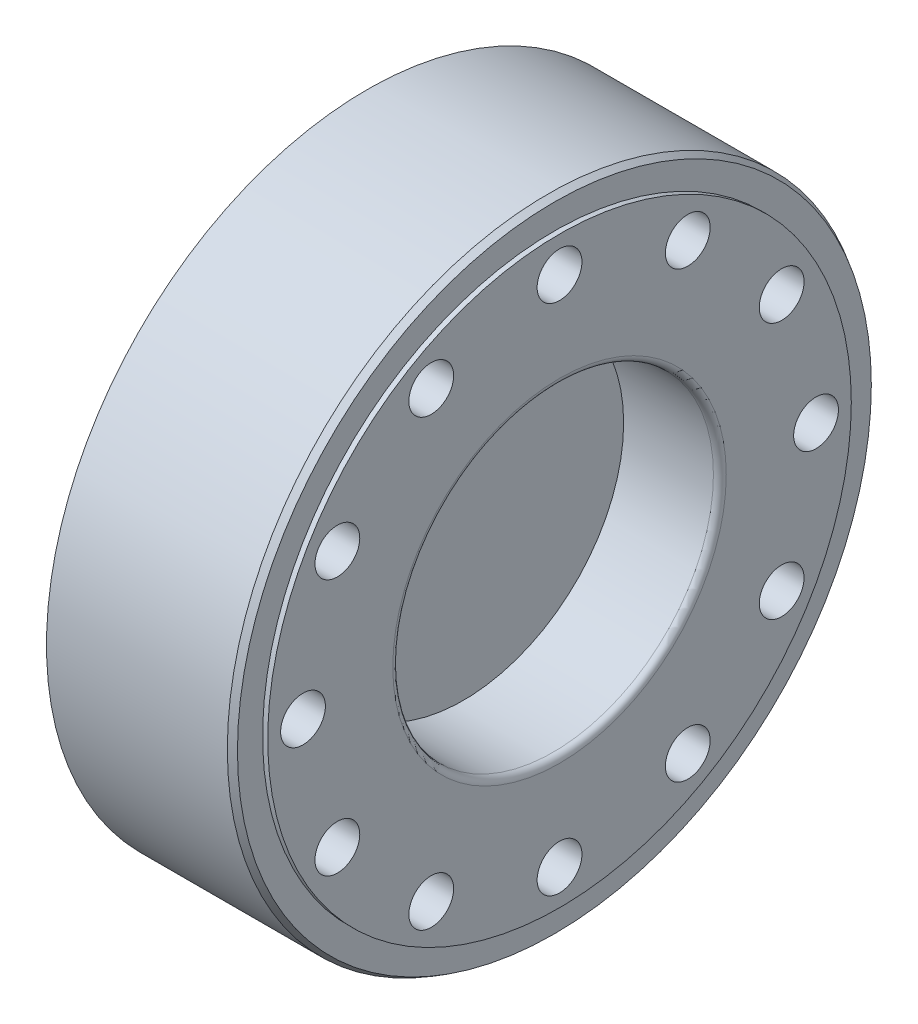
ISO-10303-21;
HEADER;
FILE_DESCRIPTION(('STEP AP214'),'2;1');
FILE_NAME('part.step','',(''),(''),'','','');
FILE_SCHEMA(('AUTOMOTIVE_DESIGN { 1 0 10303 214 1 1 1 1 }'));
ENDSEC;
DATA;
#1=APPLICATION_CONTEXT('core data for automotive mechanical design processes');
#2=APPLICATION_PROTOCOL_DEFINITION('international standard','automotive_design',2000,#1);
#3=PRODUCT_CONTEXT('',#1,'mechanical');
#4=PRODUCT('Part','Part','',(#3));
#5=PRODUCT_RELATED_PRODUCT_CATEGORY('part','',(#4));
#6=PRODUCT_DEFINITION_FORMATION('','',#4);
#7=PRODUCT_DEFINITION_CONTEXT('part definition',#1,'design');
#8=PRODUCT_DEFINITION('design','',#6,#7);
#9=PRODUCT_DEFINITION_SHAPE('','',#8);
#10=(LENGTH_UNIT() NAMED_UNIT(*) SI_UNIT(.MILLI.,.METRE.));
#11=(NAMED_UNIT(*) PLANE_ANGLE_UNIT() SI_UNIT($,.RADIAN.));
#12=(NAMED_UNIT(*) SI_UNIT($,.STERADIAN.) SOLID_ANGLE_UNIT());
#13=UNCERTAINTY_MEASURE_WITH_UNIT(LENGTH_MEASURE(1.E-05),#10,'distance_accuracy_value','');
#14=(GEOMETRIC_REPRESENTATION_CONTEXT(3) GLOBAL_UNCERTAINTY_ASSIGNED_CONTEXT((#13)) GLOBAL_UNIT_ASSIGNED_CONTEXT((#10,
#11,#12)) REPRESENTATION_CONTEXT('',''));
#15=CARTESIAN_POINT('',(0.,0.,0.));
#16=DIRECTION('',(0.,0.,1.));
#17=DIRECTION('',(1.,0.,0.));
#18=AXIS2_PLACEMENT_3D('',#15,#16,#17);
#19=CARTESIAN_POINT('',(71.9999999999994,0.,0.));
#20=DIRECTION('',(-1.,0.,0.));
#21=DIRECTION('',(0.,0.,1.));
#22=AXIS2_PLACEMENT_3D('',#19,#20,#21);
#23=PLANE('',#22);
#24=CARTESIAN_POINT('',(71.9999999999994,0.,0.));
#25=DIRECTION('',(1.,0.,0.));
#26=DIRECTION('',(0.,0.,-1.));
#27=AXIS2_PLACEMENT_3D('',#24,#25,#26);
#28=CIRCLE('',#27,25.);
#29=CARTESIAN_POINT('',(71.9999999999994,0.,-25.));
#30=VERTEX_POINT('',#29);
#31=EDGE_CURVE('E91',#30,#30,#28,.T.);
#32=ORIENTED_EDGE('',*,*,#31,.T.);
#33=EDGE_LOOP('',(#32));
#34=FACE_BOUND('',#33,.T.);
#35=ADVANCED_FACE('F16',(#34),#23,.F.);
#36=CARTESIAN_POINT('',(86.9999999999994,0.,0.));
#37=DIRECTION('',(1.,0.,0.));
#38=DIRECTION('',(0.,0.,-1.));
#39=AXIS2_PLACEMENT_3D('',#36,#37,#38);
#40=CYLINDRICAL_SURFACE('',#39,25.);
#41=ORIENTED_EDGE('',*,*,#31,.F.);
#42=EDGE_LOOP('',(#41));
#43=FACE_BOUND('',#42,.T.);
#44=CARTESIAN_POINT('',(85.9999999999994,0.,0.));
#45=DIRECTION('',(-1.,0.,0.));
#46=DIRECTION('',(0.,0.,1.));
#47=AXIS2_PLACEMENT_3D('',#44,#45,#46);
#48=CIRCLE('',#47,25.);
#49=CARTESIAN_POINT('',(85.9999999999994,0.,25.));
#50=VERTEX_POINT('',#49);
#51=EDGE_CURVE('E85',#50,#50,#48,.T.);
#52=ORIENTED_EDGE('',*,*,#51,.F.);
#53=EDGE_LOOP('',(#52));
#54=FACE_BOUND('',#53,.T.);
#55=ADVANCED_FACE('F78',(#43,#54),#40,.F.);
#56=CARTESIAN_POINT('',(65.9999999999741,34.6410161513775,-20.));
#57=DIRECTION('',(1.,0.,0.));
#58=DIRECTION('',(0.,0.,-1.));
#59=AXIS2_PLACEMENT_3D('',#56,#57,#58);
#60=CONICAL_SURFACE('',#59,3.4925625000647,1.02974425868042);
#61=CARTESIAN_POINT('',(63.9014567342429,34.6410161513775,-20.));
#62=VERTEX_POINT('',#61);
#63=VERTEX_LOOP('',#62);
#64=FACE_BOUND('',#63,.T.);
#65=CARTESIAN_POINT('',(65.9999999999994,34.6410161513775,-20.));
#66=DIRECTION('',(1.,0.,0.));
#67=DIRECTION('',(0.,0.,-1.));
#68=AXIS2_PLACEMENT_3D('',#65,#66,#67);
#69=CIRCLE('',#68,3.4925625);
#70=CARTESIAN_POINT('',(65.9999999999994,34.6410161513775,-23.4925625));
#71=VERTEX_POINT('',#70);
#72=EDGE_CURVE('E82',#71,#71,#69,.T.);
#73=ORIENTED_EDGE('',*,*,#72,.T.);
#74=EDGE_LOOP('',(#73));
#75=FACE_BOUND('',#74,.T.);
#76=ADVANCED_FACE('F74',(#64,#75),#60,.F.);
#77=CARTESIAN_POINT('',(65.9999999999172,20.,-34.6410161513776));
#78=DIRECTION('',(1.,0.,0.));
#79=DIRECTION('',(0.,0.,-1.));
#80=AXIS2_PLACEMENT_3D('',#77,#78,#79);
#81=CONICAL_SURFACE('',#80,3.49256249991139,1.02974425867639);
#82=CARTESIAN_POINT('',(63.9014567342429,20.,-34.6410161513776));
#83=VERTEX_POINT('',#82);
#84=VERTEX_LOOP('',#83);
#85=FACE_BOUND('',#84,.T.);
#86=CARTESIAN_POINT('',(65.9999999999994,20.,-34.6410161513776));
#87=DIRECTION('',(1.,0.,0.));
#88=DIRECTION('',(0.,0.,-1.));
#89=AXIS2_PLACEMENT_3D('',#86,#87,#88);
#90=CIRCLE('',#89,3.4925625);
#91=CARTESIAN_POINT('',(65.9999999999994,20.,-38.1335786513776));
#92=VERTEX_POINT('',#91);
#93=EDGE_CURVE('E84',#92,#92,#90,.T.);
#94=ORIENTED_EDGE('',*,*,#93,.T.);
#95=EDGE_LOOP('',(#94));
#96=FACE_BOUND('',#95,.T.);
#97=ADVANCED_FACE('F77',(#85,#96),#81,.F.);
#98=CARTESIAN_POINT('',(65.9999999998604,0.,-40.));
#99=DIRECTION('',(1.,0.,0.));
#100=DIRECTION('',(0.,0.,-1.));
#101=AXIS2_PLACEMENT_3D('',#98,#99,#100);
#102=CONICAL_SURFACE('',#101,3.49256249984362,1.0297442585994);
#103=CARTESIAN_POINT('',(63.9014567341007,-1.4210854715202E-10,-40.));
#104=VERTEX_POINT('',#103);
#105=VERTEX_LOOP('',#104);
#106=FACE_BOUND('',#105,.T.);
#107=CARTESIAN_POINT('',(65.9999999999994,0.,-40.));
#108=DIRECTION('',(1.,0.,0.));
#109=DIRECTION('',(0.,0.,-1.));
#110=AXIS2_PLACEMENT_3D('',#107,#108,#109);
#111=CIRCLE('',#110,3.4925625);
#112=CARTESIAN_POINT('',(65.9999999999994,0.,-43.4925625));
#113=VERTEX_POINT('',#112);
#114=EDGE_CURVE('E88',#113,#113,#111,.T.);
#115=ORIENTED_EDGE('',*,*,#114,.T.);
#116=EDGE_LOOP('',(#115));
#117=FACE_BOUND('',#116,.T.);
#118=ADVANCED_FACE('F181',(#106,#117),#102,.F.);
#119=CARTESIAN_POINT('',(66.0000000000309,-20.,-34.6410161513775));
#120=DIRECTION('',(1.,0.,0.));
#121=DIRECTION('',(0.,0.,-1.));
#122=AXIS2_PLACEMENT_3D('',#119,#120,#121);
#123=CONICAL_SURFACE('',#122,3.49256250014235,1.02974425867828);
#124=CARTESIAN_POINT('',(63.9014567342429,-20.,-34.6410161513775));
#125=VERTEX_POINT('',#124);
#126=VERTEX_LOOP('',#125);
#127=FACE_BOUND('',#126,.T.);
#128=CARTESIAN_POINT('',(65.9999999999994,-20.,-34.6410161513775));
#129=DIRECTION('',(1.,0.,0.));
#130=DIRECTION('',(0.,0.,-1.));
#131=AXIS2_PLACEMENT_3D('',#128,#129,#130);
#132=CIRCLE('',#131,3.4925625);
#133=CARTESIAN_POINT('',(65.9999999999994,-20.,-38.1335786513775));
#134=VERTEX_POINT('',#133);
#135=EDGE_CURVE('E176',#134,#134,#132,.T.);
#136=ORIENTED_EDGE('',*,*,#135,.T.);
#137=EDGE_LOOP('',(#136));
#138=FACE_BOUND('',#137,.T.);
#139=ADVANCED_FACE('F286',(#127,#138),#123,.F.);
#140=CARTESIAN_POINT('',(65.9999999999172,-34.6410161513776,-20.));
#141=DIRECTION('',(1.,0.,0.));
#142=DIRECTION('',(0.,0.,-1.));
#143=AXIS2_PLACEMENT_3D('',#140,#141,#142);
#144=CONICAL_SURFACE('',#143,3.49256249991139,1.02974425867639);
#145=CARTESIAN_POINT('',(63.9014567342429,-34.6410161513776,-20.));
#146=VERTEX_POINT('',#145);
#147=VERTEX_LOOP('',#146);
#148=FACE_BOUND('',#147,.T.);
#149=CARTESIAN_POINT('',(65.9999999999994,-34.6410161513776,-20.));
#150=DIRECTION('',(1.,0.,0.));
#151=DIRECTION('',(0.,0.,-1.));
#152=AXIS2_PLACEMENT_3D('',#149,#150,#151);
#153=CIRCLE('',#152,3.4925625);
#154=CARTESIAN_POINT('',(65.9999999999994,-34.6410161513776,-23.4925625));
#155=VERTEX_POINT('',#154);
#156=EDGE_CURVE('E173',#155,#155,#153,.T.);
#157=ORIENTED_EDGE('',*,*,#156,.T.);
#158=EDGE_LOOP('',(#157));
#159=FACE_BOUND('',#158,.T.);
#160=ADVANCED_FACE('F282',(#148,#159),#144,.F.);
#161=CARTESIAN_POINT('',(65.9999999998604,-40.,0.));
#162=DIRECTION('',(1.,0.,0.));
#163=DIRECTION('',(0.,0.,-1.));
#164=AXIS2_PLACEMENT_3D('',#161,#162,#163);
#165=CONICAL_SURFACE('',#164,3.49256249984363,1.0297442585994);
#166=CARTESIAN_POINT('',(63.9014567341007,-40.,1.4210854715202E-10));
#167=VERTEX_POINT('',#166);
#168=VERTEX_LOOP('',#167);
#169=FACE_BOUND('',#168,.T.);
#170=CARTESIAN_POINT('',(65.9999999999994,-40.,0.));
#171=DIRECTION('',(1.,0.,0.));
#172=DIRECTION('',(0.,0.,-1.));
#173=AXIS2_PLACEMENT_3D('',#170,#171,#172);
#174=CIRCLE('',#173,3.4925625);
#175=CARTESIAN_POINT('',(65.9999999999994,-40.,-3.49256249999999));
#176=VERTEX_POINT('',#175);
#177=EDGE_CURVE('E170',#176,#176,#174,.T.);
#178=ORIENTED_EDGE('',*,*,#177,.T.);
#179=EDGE_LOOP('',(#178));
#180=FACE_BOUND('',#179,.T.);
#181=ADVANCED_FACE('F278',(#169,#180),#165,.F.);
#182=CARTESIAN_POINT('',(65.9999999998604,-34.6410161513775,20.));
#183=DIRECTION('',(1.,0.,0.));
#184=DIRECTION('',(0.,0.,-1.));
#185=AXIS2_PLACEMENT_3D('',#182,#183,#184);
#186=CONICAL_SURFACE('',#185,3.49256249986018,1.02974425862017);
#187=CARTESIAN_POINT('',(63.9014567341292,-34.6410161514059,19.9999999999147));
#188=VERTEX_POINT('',#187);
#189=VERTEX_LOOP('',#188);
#190=FACE_BOUND('',#189,.T.);
#191=CARTESIAN_POINT('',(65.9999999999994,-34.6410161513775,20.));
#192=DIRECTION('',(1.,0.,0.));
#193=DIRECTION('',(0.,0.,-1.));
#194=AXIS2_PLACEMENT_3D('',#191,#192,#193);
#195=CIRCLE('',#194,3.4925625);
#196=CARTESIAN_POINT('',(65.9999999999994,-34.6410161513775,16.5074375));
#197=VERTEX_POINT('',#196);
#198=EDGE_CURVE('E167',#197,#197,#195,.T.);
#199=ORIENTED_EDGE('',*,*,#198,.T.);
#200=EDGE_LOOP('',(#199));
#201=FACE_BOUND('',#200,.T.);
#202=ADVANCED_FACE('F274',(#190,#201),#186,.F.);
#203=CARTESIAN_POINT('',(65.9999999999172,-20.,34.6410161513776));
#204=DIRECTION('',(1.,0.,0.));
#205=DIRECTION('',(0.,0.,-1.));
#206=AXIS2_PLACEMENT_3D('',#203,#204,#205);
#207=CONICAL_SURFACE('',#206,3.49256249998903,1.02974425864585);
#208=CARTESIAN_POINT('',(63.9014567341576,-20.0000000000568,34.6410161513492));
#209=VERTEX_POINT('',#208);
#210=VERTEX_LOOP('',#209);
#211=FACE_BOUND('',#210,.T.);
#212=CARTESIAN_POINT('',(65.9999999999994,-20.,34.6410161513776));
#213=DIRECTION('',(1.,0.,0.));
#214=DIRECTION('',(0.,0.,-1.));
#215=AXIS2_PLACEMENT_3D('',#212,#213,#214);
#216=CIRCLE('',#215,3.4925625);
#217=CARTESIAN_POINT('',(65.9999999999994,-20.,31.1484536513776));
#218=VERTEX_POINT('',#217);
#219=EDGE_CURVE('E164',#218,#218,#216,.T.);
#220=ORIENTED_EDGE('',*,*,#219,.T.);
#221=EDGE_LOOP('',(#220));
#222=FACE_BOUND('',#221,.T.);
#223=ADVANCED_FACE('F270',(#211,#222),#207,.F.);
#224=CARTESIAN_POINT('',(65.9999999998604,0.,40.));
#225=DIRECTION('',(1.,0.,0.));
#226=DIRECTION('',(0.,0.,-1.));
#227=AXIS2_PLACEMENT_3D('',#224,#225,#226);
#228=CONICAL_SURFACE('',#227,3.49256249984364,1.02974425859941);
#229=CARTESIAN_POINT('',(63.9014567341007,1.4210854715202E-10,40.));
#230=VERTEX_POINT('',#229);
#231=VERTEX_LOOP('',#230);
#232=FACE_BOUND('',#231,.T.);
#233=CARTESIAN_POINT('',(65.9999999999994,0.,40.));
#234=DIRECTION('',(1.,0.,0.));
#235=DIRECTION('',(0.,0.,-1.));
#236=AXIS2_PLACEMENT_3D('',#233,#234,#235);
#237=CIRCLE('',#236,3.4925625);
#238=CARTESIAN_POINT('',(65.9999999999994,0.,36.5074375));
#239=VERTEX_POINT('',#238);
#240=EDGE_CURVE('E161',#239,#239,#237,.T.);
#241=ORIENTED_EDGE('',*,*,#240,.T.);
#242=EDGE_LOOP('',(#241));
#243=FACE_BOUND('',#242,.T.);
#244=ADVANCED_FACE('F266',(#232,#243),#228,.F.);
#245=CARTESIAN_POINT('',(65.9999999999172,20.,34.6410161513775));
#246=DIRECTION('',(1.,0.,0.));
#247=DIRECTION('',(0.,0.,-1.));
#248=AXIS2_PLACEMENT_3D('',#245,#246,#247);
#249=CONICAL_SURFACE('',#248,3.49256249995863,1.02974425862065);
#250=CARTESIAN_POINT('',(63.9014567341007,19.9999999999716,34.6410161514059));
#251=VERTEX_POINT('',#250);
#252=VERTEX_LOOP('',#251);
#253=FACE_BOUND('',#252,.T.);
#254=CARTESIAN_POINT('',(65.9999999999994,20.,34.6410161513775));
#255=DIRECTION('',(1.,0.,0.));
#256=DIRECTION('',(0.,0.,-1.));
#257=AXIS2_PLACEMENT_3D('',#254,#255,#256);
#258=CIRCLE('',#257,3.4925625);
#259=CARTESIAN_POINT('',(65.9999999999994,20.,31.1484536513775));
#260=VERTEX_POINT('',#259);
#261=EDGE_CURVE('E153',#260,#260,#258,.T.);
#262=ORIENTED_EDGE('',*,*,#261,.T.);
#263=EDGE_LOOP('',(#262));
#264=FACE_BOUND('',#263,.T.);
#265=ADVANCED_FACE('F262',(#253,#264),#249,.F.);
#266=CARTESIAN_POINT('',(65.9999999999172,34.6410161513775,20.));
#267=DIRECTION('',(1.,0.,0.));
#268=DIRECTION('',(0.,0.,-1.));
#269=AXIS2_PLACEMENT_3D('',#266,#267,#268);
#270=CONICAL_SURFACE('',#269,3.49256249998909,1.02974425859672);
#271=CARTESIAN_POINT('',(63.9014567340723,34.6410161513207,20.0000000000853));
#272=VERTEX_POINT('',#271);
#273=VERTEX_LOOP('',#272);
#274=FACE_BOUND('',#273,.T.);
#275=CARTESIAN_POINT('',(65.9999999999994,34.6410161513775,20.));
#276=DIRECTION('',(1.,0.,0.));
#277=DIRECTION('',(0.,0.,-1.));
#278=AXIS2_PLACEMENT_3D('',#275,#276,#277);
#279=CIRCLE('',#278,3.4925625);
#280=CARTESIAN_POINT('',(65.9999999999994,34.6410161513775,16.5074375));
#281=VERTEX_POINT('',#280);
#282=EDGE_CURVE('E148',#281,#281,#279,.T.);
#283=ORIENTED_EDGE('',*,*,#282,.T.);
#284=EDGE_LOOP('',(#283));
#285=FACE_BOUND('',#284,.T.);
#286=ADVANCED_FACE('F258',(#274,#285),#270,.F.);
#287=CARTESIAN_POINT('',(65.9999999998604,40.,0.));
#288=DIRECTION('',(1.,0.,0.));
#289=DIRECTION('',(0.,0.,-1.));
#290=AXIS2_PLACEMENT_3D('',#287,#288,#289);
#291=CONICAL_SURFACE('',#290,3.49256249984365,1.02974425859941);
#292=CARTESIAN_POINT('',(63.9014567341007,40.,-1.4210854715202E-10));
#293=VERTEX_POINT('',#292);
#294=VERTEX_LOOP('',#293);
#295=FACE_BOUND('',#294,.T.);
#296=CARTESIAN_POINT('',(65.9999999999994,40.,0.));
#297=DIRECTION('',(1.,0.,0.));
#298=DIRECTION('',(0.,0.,-1.));
#299=AXIS2_PLACEMENT_3D('',#296,#297,#298);
#300=CIRCLE('',#299,3.4925625);
#301=CARTESIAN_POINT('',(65.9999999999994,40.,-3.4925625));
#302=VERTEX_POINT('',#301);
#303=EDGE_CURVE('E146',#302,#302,#300,.T.);
#304=ORIENTED_EDGE('',*,*,#303,.T.);
#305=EDGE_LOOP('',(#304));
#306=FACE_BOUND('',#305,.T.);
#307=ADVANCED_FACE('F212',(#295,#306),#291,.F.);
#308=CARTESIAN_POINT('',(85.9999999999994,0.,0.));
#309=DIRECTION('',(-1.,0.,0.));
#310=DIRECTION('',(0.,0.,1.));
#311=AXIS2_PLACEMENT_3D('',#308,#309,#310);
#312=TOROIDAL_SURFACE('',#311,26.,1.);
#313=ORIENTED_EDGE('',*,*,#51,.T.);
#314=EDGE_LOOP('',(#313));
#315=FACE_BOUND('',#314,.T.);
#316=CARTESIAN_POINT('',(86.9999999999994,0.,0.));
#317=DIRECTION('',(1.,0.,0.));
#318=DIRECTION('',(0.,0.,-1.));
#319=AXIS2_PLACEMENT_3D('',#316,#317,#318);
#320=CIRCLE('',#319,26.);
#321=CARTESIAN_POINT('',(86.9999999999994,0.,-26.));
#322=VERTEX_POINT('',#321);
#323=CARTESIAN_POINT('',(86.9999999999994,0.,26.));
#324=VERTEX_POINT('',#323);
#325=EDGE_CURVE('E35',#322,#324,#320,.T.);
#326=ORIENTED_EDGE('',*,*,#325,.T.);
#327=CARTESIAN_POINT('',(86.9999999999994,0.,0.));
#328=DIRECTION('',(1.,0.,0.));
#329=DIRECTION('',(0.,0.,1.));
#330=AXIS2_PLACEMENT_3D('',#327,#328,#329);
#331=CIRCLE('',#330,26.);
#332=EDGE_CURVE('E142',#324,#322,#331,.T.);
#333=ORIENTED_EDGE('',*,*,#332,.T.);
#334=EDGE_LOOP('',(#326,#333));
#335=FACE_BOUND('',#334,.T.);
#336=ADVANCED_FACE('F143',(#315,#335),#312,.T.);
#337=CARTESIAN_POINT('',(86.9999999999994,34.6410161513775,-20.));
#338=DIRECTION('',(1.,0.,0.));
#339=DIRECTION('',(0.,0.,-1.));
#340=AXIS2_PLACEMENT_3D('',#337,#338,#339);
#341=CYLINDRICAL_SURFACE('',#340,3.4925625);
#342=ORIENTED_EDGE('',*,*,#72,.F.);
#343=EDGE_LOOP('',(#342));
#344=FACE_BOUND('',#343,.T.);
#345=CARTESIAN_POINT('',(86.9999999999994,34.6410161513775,-20.));
#346=DIRECTION('',(1.,0.,0.));
#347=DIRECTION('',(0.,0.,-1.));
#348=AXIS2_PLACEMENT_3D('',#345,#346,#347);
#349=CIRCLE('',#348,3.4925625);
#350=CARTESIAN_POINT('',(86.9999999999994,34.6410161513775,-23.4925625));
#351=VERTEX_POINT('',#350);
#352=EDGE_CURVE('E137',#351,#351,#349,.T.);
#353=ORIENTED_EDGE('',*,*,#352,.T.);
#354=EDGE_LOOP('',(#353));
#355=FACE_BOUND('',#354,.T.);
#356=ADVANCED_FACE('F202',(#344,#355),#341,.F.);
#357=CARTESIAN_POINT('',(86.9999999999994,20.,-34.6410161513776));
#358=DIRECTION('',(1.,0.,0.));
#359=DIRECTION('',(0.,0.,-1.));
#360=AXIS2_PLACEMENT_3D('',#357,#358,#359);
#361=CYLINDRICAL_SURFACE('',#360,3.4925625);
#362=ORIENTED_EDGE('',*,*,#93,.F.);
#363=EDGE_LOOP('',(#362));
#364=FACE_BOUND('',#363,.T.);
#365=CARTESIAN_POINT('',(86.9999999999994,20.,-34.6410161513776));
#366=DIRECTION('',(1.,0.,0.));
#367=DIRECTION('',(0.,0.,-1.));
#368=AXIS2_PLACEMENT_3D('',#365,#366,#367);
#369=CIRCLE('',#368,3.4925625);
#370=CARTESIAN_POINT('',(86.9999999999994,20.,-38.1335786513776));
#371=VERTEX_POINT('',#370);
#372=EDGE_CURVE('E134',#371,#371,#369,.T.);
#373=ORIENTED_EDGE('',*,*,#372,.T.);
#374=EDGE_LOOP('',(#373));
#375=FACE_BOUND('',#374,.T.);
#376=ADVANCED_FACE('F187',(#364,#375),#361,.F.);
#377=CARTESIAN_POINT('',(86.9999999999994,0.,-40.));
#378=DIRECTION('',(1.,0.,0.));
#379=DIRECTION('',(0.,0.,-1.));
#380=AXIS2_PLACEMENT_3D('',#377,#378,#379);
#381=CYLINDRICAL_SURFACE('',#380,3.4925625);
#382=ORIENTED_EDGE('',*,*,#114,.F.);
#383=EDGE_LOOP('',(#382));
#384=FACE_BOUND('',#383,.T.);
#385=CARTESIAN_POINT('',(86.9999999999994,0.,-40.));
#386=DIRECTION('',(1.,0.,0.));
#387=DIRECTION('',(0.,0.,-1.));
#388=AXIS2_PLACEMENT_3D('',#385,#386,#387);
#389=CIRCLE('',#388,3.4925625);
#390=CARTESIAN_POINT('',(86.9999999999994,0.,-43.4925625));
#391=VERTEX_POINT('',#390);
#392=EDGE_CURVE('E131',#391,#391,#389,.T.);
#393=ORIENTED_EDGE('',*,*,#392,.T.);
#394=EDGE_LOOP('',(#393));
#395=FACE_BOUND('',#394,.T.);
#396=ADVANCED_FACE('F183',(#384,#395),#381,.F.);
#397=CARTESIAN_POINT('',(86.9999999999994,-20.,-34.6410161513775));
#398=DIRECTION('',(1.,0.,0.));
#399=DIRECTION('',(0.,0.,-1.));
#400=AXIS2_PLACEMENT_3D('',#397,#398,#399);
#401=CYLINDRICAL_SURFACE('',#400,3.4925625);
#402=ORIENTED_EDGE('',*,*,#135,.F.);
#403=EDGE_LOOP('',(#402));
#404=FACE_BOUND('',#403,.T.);
#405=CARTESIAN_POINT('',(86.9999999999994,-20.,-34.6410161513775));
#406=DIRECTION('',(1.,0.,0.));
#407=DIRECTION('',(0.,0.,-1.));
#408=AXIS2_PLACEMENT_3D('',#405,#406,#407);
#409=CIRCLE('',#408,3.4925625);
#410=CARTESIAN_POINT('',(86.9999999999994,-20.,-38.1335786513775));
#411=VERTEX_POINT('',#410);
#412=EDGE_CURVE('E128',#411,#411,#409,.T.);
#413=ORIENTED_EDGE('',*,*,#412,.T.);
#414=EDGE_LOOP('',(#413));
#415=FACE_BOUND('',#414,.T.);
#416=ADVANCED_FACE('F186',(#404,#415),#401,.F.);
#417=CARTESIAN_POINT('',(86.9999999999994,-34.6410161513776,-20.));
#418=DIRECTION('',(1.,0.,0.));
#419=DIRECTION('',(0.,0.,-1.));
#420=AXIS2_PLACEMENT_3D('',#417,#418,#419);
#421=CYLINDRICAL_SURFACE('',#420,3.4925625);
#422=ORIENTED_EDGE('',*,*,#156,.F.);
#423=EDGE_LOOP('',(#422));
#424=FACE_BOUND('',#423,.T.);
#425=CARTESIAN_POINT('',(86.9999999999994,-34.6410161513776,-20.));
#426=DIRECTION('',(1.,0.,0.));
#427=DIRECTION('',(0.,0.,-1.));
#428=AXIS2_PLACEMENT_3D('',#425,#426,#427);
#429=CIRCLE('',#428,3.4925625);
#430=CARTESIAN_POINT('',(86.9999999999994,-34.6410161513776,-23.4925625));
#431=VERTEX_POINT('',#430);
#432=EDGE_CURVE('E125',#431,#431,#429,.T.);
#433=ORIENTED_EDGE('',*,*,#432,.T.);
#434=EDGE_LOOP('',(#433));
#435=FACE_BOUND('',#434,.T.);
#436=ADVANCED_FACE('F419',(#424,#435),#421,.F.);
#437=CARTESIAN_POINT('',(86.9999999999994,-40.,0.));
#438=DIRECTION('',(1.,0.,0.));
#439=DIRECTION('',(0.,0.,-1.));
#440=AXIS2_PLACEMENT_3D('',#437,#438,#439);
#441=CYLINDRICAL_SURFACE('',#440,3.4925625);
#442=ORIENTED_EDGE('',*,*,#177,.F.);
#443=EDGE_LOOP('',(#442));
#444=FACE_BOUND('',#443,.T.);
#445=CARTESIAN_POINT('',(86.9999999999994,-40.,0.));
#446=DIRECTION('',(1.,0.,0.));
#447=DIRECTION('',(0.,0.,-1.));
#448=AXIS2_PLACEMENT_3D('',#445,#446,#447);
#449=CIRCLE('',#448,3.4925625);
#450=CARTESIAN_POINT('',(86.9999999999994,-40.,-3.49256249999999));
#451=VERTEX_POINT('',#450);
#452=EDGE_CURVE('E122',#451,#451,#449,.T.);
#453=ORIENTED_EDGE('',*,*,#452,.T.);
#454=EDGE_LOOP('',(#453));
#455=FACE_BOUND('',#454,.T.);
#456=ADVANCED_FACE('F429',(#444,#455),#441,.F.);
#457=CARTESIAN_POINT('',(86.9999999999994,-34.6410161513775,20.));
#458=DIRECTION('',(1.,0.,0.));
#459=DIRECTION('',(0.,0.,-1.));
#460=AXIS2_PLACEMENT_3D('',#457,#458,#459);
#461=CYLINDRICAL_SURFACE('',#460,3.4925625);
#462=ORIENTED_EDGE('',*,*,#198,.F.);
#463=EDGE_LOOP('',(#462));
#464=FACE_BOUND('',#463,.T.);
#465=CARTESIAN_POINT('',(86.9999999999994,-34.6410161513775,20.));
#466=DIRECTION('',(1.,0.,0.));
#467=DIRECTION('',(0.,0.,-1.));
#468=AXIS2_PLACEMENT_3D('',#465,#466,#467);
#469=CIRCLE('',#468,3.4925625);
#470=CARTESIAN_POINT('',(86.9999999999994,-34.6410161513775,16.5074375));
#471=VERTEX_POINT('',#470);
#472=EDGE_CURVE('E119',#471,#471,#469,.T.);
#473=ORIENTED_EDGE('',*,*,#472,.T.);
#474=EDGE_LOOP('',(#473));
#475=FACE_BOUND('',#474,.T.);
#476=ADVANCED_FACE('F439',(#464,#475),#461,.F.);
#477=CARTESIAN_POINT('',(86.9999999999994,-20.,34.6410161513776));
#478=DIRECTION('',(1.,0.,0.));
#479=DIRECTION('',(0.,0.,-1.));
#480=AXIS2_PLACEMENT_3D('',#477,#478,#479);
#481=CYLINDRICAL_SURFACE('',#480,3.4925625);
#482=ORIENTED_EDGE('',*,*,#219,.F.);
#483=EDGE_LOOP('',(#482));
#484=FACE_BOUND('',#483,.T.);
#485=CARTESIAN_POINT('',(86.9999999999994,-20.,34.6410161513776));
#486=DIRECTION('',(1.,0.,0.));
#487=DIRECTION('',(0.,0.,-1.));
#488=AXIS2_PLACEMENT_3D('',#485,#486,#487);
#489=CIRCLE('',#488,3.4925625);
#490=CARTESIAN_POINT('',(86.9999999999994,-20.,31.1484536513776));
#491=VERTEX_POINT('',#490);
#492=EDGE_CURVE('E116',#491,#491,#489,.T.);
#493=ORIENTED_EDGE('',*,*,#492,.T.);
#494=EDGE_LOOP('',(#493));
#495=FACE_BOUND('',#494,.T.);
#496=ADVANCED_FACE('F449',(#484,#495),#481,.F.);
#497=CARTESIAN_POINT('',(86.9999999999994,0.,40.));
#498=DIRECTION('',(1.,0.,0.));
#499=DIRECTION('',(0.,0.,-1.));
#500=AXIS2_PLACEMENT_3D('',#497,#498,#499);
#501=CYLINDRICAL_SURFACE('',#500,3.4925625);
#502=ORIENTED_EDGE('',*,*,#240,.F.);
#503=EDGE_LOOP('',(#502));
#504=FACE_BOUND('',#503,.T.);
#505=CARTESIAN_POINT('',(86.9999999999994,0.,40.));
#506=DIRECTION('',(1.,0.,0.));
#507=DIRECTION('',(0.,0.,-1.));
#508=AXIS2_PLACEMENT_3D('',#505,#506,#507);
#509=CIRCLE('',#508,3.4925625);
#510=CARTESIAN_POINT('',(86.9999999999994,0.,36.5074375));
#511=VERTEX_POINT('',#510);
#512=EDGE_CURVE('E113',#511,#511,#509,.T.);
#513=ORIENTED_EDGE('',*,*,#512,.T.);
#514=EDGE_LOOP('',(#513));
#515=FACE_BOUND('',#514,.T.);
#516=ADVANCED_FACE('F459',(#504,#515),#501,.F.);
#517=CARTESIAN_POINT('',(86.9999999999994,20.,34.6410161513775));
#518=DIRECTION('',(1.,0.,0.));
#519=DIRECTION('',(0.,0.,-1.));
#520=AXIS2_PLACEMENT_3D('',#517,#518,#519);
#521=CYLINDRICAL_SURFACE('',#520,3.4925625);
#522=ORIENTED_EDGE('',*,*,#261,.F.);
#523=EDGE_LOOP('',(#522));
#524=FACE_BOUND('',#523,.T.);
#525=CARTESIAN_POINT('',(86.9999999999994,20.,34.6410161513775));
#526=DIRECTION('',(1.,0.,0.));
#527=DIRECTION('',(0.,0.,-1.));
#528=AXIS2_PLACEMENT_3D('',#525,#526,#527);
#529=CIRCLE('',#528,3.4925625);
#530=CARTESIAN_POINT('',(86.9999999999994,20.,31.1484536513775));
#531=VERTEX_POINT('',#530);
#532=EDGE_CURVE('E110',#531,#531,#529,.T.);
#533=ORIENTED_EDGE('',*,*,#532,.T.);
#534=EDGE_LOOP('',(#533));
#535=FACE_BOUND('',#534,.T.);
#536=ADVANCED_FACE('F469',(#524,#535),#521,.F.);
#537=CARTESIAN_POINT('',(86.9999999999994,34.6410161513775,20.));
#538=DIRECTION('',(1.,0.,0.));
#539=DIRECTION('',(0.,0.,-1.));
#540=AXIS2_PLACEMENT_3D('',#537,#538,#539);
#541=CYLINDRICAL_SURFACE('',#540,3.4925625);
#542=ORIENTED_EDGE('',*,*,#282,.F.);
#543=EDGE_LOOP('',(#542));
#544=FACE_BOUND('',#543,.T.);
#545=CARTESIAN_POINT('',(86.9999999999994,34.6410161513775,20.));
#546=DIRECTION('',(1.,0.,0.));
#547=DIRECTION('',(0.,0.,-1.));
#548=AXIS2_PLACEMENT_3D('',#545,#546,#547);
#549=CIRCLE('',#548,3.4925625);
#550=CARTESIAN_POINT('',(86.9999999999994,34.6410161513775,16.5074375));
#551=VERTEX_POINT('',#550);
#552=EDGE_CURVE('E107',#551,#551,#549,.T.);
#553=ORIENTED_EDGE('',*,*,#552,.T.);
#554=EDGE_LOOP('',(#553));
#555=FACE_BOUND('',#554,.T.);
#556=ADVANCED_FACE('F479',(#544,#555),#541,.F.);
#557=CARTESIAN_POINT('',(86.9999999999994,40.,0.));
#558=DIRECTION('',(1.,0.,0.));
#559=DIRECTION('',(0.,0.,-1.));
#560=AXIS2_PLACEMENT_3D('',#557,#558,#559);
#561=CYLINDRICAL_SURFACE('',#560,3.4925625);
#562=ORIENTED_EDGE('',*,*,#303,.F.);
#563=EDGE_LOOP('',(#562));
#564=FACE_BOUND('',#563,.T.);
#565=CARTESIAN_POINT('',(86.9999999999994,40.,0.));
#566=DIRECTION('',(1.,0.,0.));
#567=DIRECTION('',(0.,0.,-1.));
#568=AXIS2_PLACEMENT_3D('',#565,#566,#567);
#569=CIRCLE('',#568,3.4925625);
#570=CARTESIAN_POINT('',(86.9999999999994,40.,-3.4925625));
#571=VERTEX_POINT('',#570);
#572=EDGE_CURVE('E104',#571,#571,#569,.T.);
#573=ORIENTED_EDGE('',*,*,#572,.T.);
#574=EDGE_LOOP('',(#573));
#575=FACE_BOUND('',#574,.T.);
#576=ADVANCED_FACE('F195',(#564,#575),#561,.F.);
#577=CARTESIAN_POINT('',(86.9999999999994,0.,0.));
#578=DIRECTION('',(-1.,0.,0.));
#579=DIRECTION('',(0.,0.,1.));
#580=AXIS2_PLACEMENT_3D('',#577,#578,#579);
#581=PLANE('',#580);
#582=CARTESIAN_POINT('',(86.9999999999994,0.,0.));
#583=DIRECTION('',(1.,0.,0.));
#584=DIRECTION('',(0.,0.,-1.));
#585=AXIS2_PLACEMENT_3D('',#582,#583,#584);
#586=CIRCLE('',#585,45.5);
#587=CARTESIAN_POINT('',(86.9999999999994,0.,-45.5));
#588=VERTEX_POINT('',#587);
#589=EDGE_CURVE('E101',#588,#588,#586,.F.);
#590=ORIENTED_EDGE('',*,*,#589,.F.);
#591=EDGE_LOOP('',(#590));
#592=FACE_BOUND('',#591,.T.);
#593=ORIENTED_EDGE('',*,*,#572,.F.);
#594=EDGE_LOOP('',(#593));
#595=FACE_BOUND('',#594,.T.);
#596=ORIENTED_EDGE('',*,*,#552,.F.);
#597=EDGE_LOOP('',(#596));
#598=FACE_BOUND('',#597,.T.);
#599=ORIENTED_EDGE('',*,*,#532,.F.);
#600=EDGE_LOOP('',(#599));
#601=FACE_BOUND('',#600,.T.);
#602=ORIENTED_EDGE('',*,*,#512,.F.);
#603=EDGE_LOOP('',(#602));
#604=FACE_BOUND('',#603,.T.);
#605=ORIENTED_EDGE('',*,*,#492,.F.);
#606=EDGE_LOOP('',(#605));
#607=FACE_BOUND('',#606,.T.);
#608=ORIENTED_EDGE('',*,*,#472,.F.);
#609=EDGE_LOOP('',(#608));
#610=FACE_BOUND('',#609,.T.);
#611=ORIENTED_EDGE('',*,*,#452,.F.);
#612=EDGE_LOOP('',(#611));
#613=FACE_BOUND('',#612,.T.);
#614=ORIENTED_EDGE('',*,*,#432,.F.);
#615=EDGE_LOOP('',(#614));
#616=FACE_BOUND('',#615,.T.);
#617=ORIENTED_EDGE('',*,*,#412,.F.);
#618=EDGE_LOOP('',(#617));
#619=FACE_BOUND('',#618,.T.);
#620=ORIENTED_EDGE('',*,*,#392,.F.);
#621=EDGE_LOOP('',(#620));
#622=FACE_BOUND('',#621,.T.);
#623=ORIENTED_EDGE('',*,*,#372,.F.);
#624=EDGE_LOOP('',(#623));
#625=FACE_BOUND('',#624,.T.);
#626=ORIENTED_EDGE('',*,*,#352,.F.);
#627=EDGE_LOOP('',(#626));
#628=FACE_BOUND('',#627,.T.);
#629=ORIENTED_EDGE('',*,*,#332,.F.);
#630=ORIENTED_EDGE('',*,*,#325,.F.);
#631=EDGE_LOOP('',(#629,#630));
#632=FACE_BOUND('',#631,.T.);
#633=ADVANCED_FACE('F191',(#592,#595,#598,#601,#604,#607,#610,#613,#616,#619,#622,#625,#628,
#632),#581,.F.);
#634=CARTESIAN_POINT('',(80.0749999999994,0.,0.));
#635=DIRECTION('',(1.,0.,0.));
#636=DIRECTION('',(0.,0.,-1.));
#637=AXIS2_PLACEMENT_3D('',#634,#635,#636);
#638=CYLINDRICAL_SURFACE('',#637,45.5);
#639=ORIENTED_EDGE('',*,*,#589,.T.);
#640=EDGE_LOOP('',(#639));
#641=FACE_BOUND('',#640,.T.);
#642=CARTESIAN_POINT('',(86.1999999999994,0.,0.));
#643=DIRECTION('',(1.,0.,0.));
#644=DIRECTION('',(0.,0.,-1.));
#645=AXIS2_PLACEMENT_3D('',#642,#643,#644);
#646=CIRCLE('',#645,45.5);
#647=CARTESIAN_POINT('',(86.1999999999994,0.,-45.5));
#648=VERTEX_POINT('',#647);
#649=EDGE_CURVE('E98',#648,#648,#646,.T.);
#650=ORIENTED_EDGE('',*,*,#649,.T.);
#651=EDGE_LOOP('',(#650));
#652=FACE_BOUND('',#651,.T.);
#653=ADVANCED_FACE('F194',(#641,#652),#638,.T.);
#654=CARTESIAN_POINT('',(86.1999999999994,45.5,0.));
#655=DIRECTION('',(-1.,0.,0.));
#656=DIRECTION('',(0.,0.,1.));
#657=AXIS2_PLACEMENT_3D('',#654,#655,#656);
#658=PLANE('',#657);
#659=ORIENTED_EDGE('',*,*,#649,.F.);
#660=EDGE_LOOP('',(#659));
#661=FACE_BOUND('',#660,.T.);
#662=CARTESIAN_POINT('',(86.1999999999994,0.,0.));
#663=DIRECTION('',(-1.,0.,0.));
#664=DIRECTION('',(0.,0.,1.));
#665=AXIS2_PLACEMENT_3D('',#662,#663,#664);
#666=CIRCLE('',#665,49.4226497308104);
#667=CARTESIAN_POINT('',(86.1999999999994,0.,49.4226497308104));
#668=VERTEX_POINT('',#667);
#669=EDGE_CURVE('E95',#668,#668,#666,.T.);
#670=ORIENTED_EDGE('',*,*,#669,.F.);
#671=EDGE_LOOP('',(#670));
#672=FACE_BOUND('',#671,.T.);
#673=ADVANCED_FACE('F229',(#661,#672),#658,.F.);
#674=CARTESIAN_POINT('',(85.1999999999994,0.,0.));
#675=DIRECTION('',(-1.,0.,0.));
#676=DIRECTION('',(0.,0.,1.));
#677=AXIS2_PLACEMENT_3D('',#674,#675,#676);
#678=CONICAL_SURFACE('',#677,50.,0.5235987755983);
#679=ORIENTED_EDGE('',*,*,#669,.T.);
#680=EDGE_LOOP('',(#679));
#681=FACE_BOUND('',#680,.T.);
#682=CARTESIAN_POINT('',(85.1999999999994,0.,0.));
#683=DIRECTION('',(1.,0.,0.));
#684=DIRECTION('',(0.,0.,-1.));
#685=AXIS2_PLACEMENT_3D('',#682,#683,#684);
#686=CIRCLE('',#685,50.);
#687=CARTESIAN_POINT('',(85.1999999999994,0.,-50.));
#688=VERTEX_POINT('',#687);
#689=EDGE_CURVE('E27',#688,#688,#686,.F.);
#690=ORIENTED_EDGE('',*,*,#689,.F.);
#691=EDGE_LOOP('',(#690));
#692=FACE_BOUND('',#691,.T.);
#693=ADVANCED_FACE('F222',(#681,#692),#678,.T.);
#694=CARTESIAN_POINT('',(80.0749999999994,0.,0.));
#695=DIRECTION('',(1.,0.,0.));
#696=DIRECTION('',(0.,0.,-1.));
#697=AXIS2_PLACEMENT_3D('',#694,#695,#696);
#698=CYLINDRICAL_SURFACE('',#697,50.);
#699=ORIENTED_EDGE('',*,*,#689,.T.);
#700=EDGE_LOOP('',(#699));
#701=FACE_BOUND('',#700,.T.);
#702=CARTESIAN_POINT('',(56.9999999999994,0.,0.));
#703=DIRECTION('',(1.,0.,0.));
#704=DIRECTION('',(0.,0.,-1.));
#705=AXIS2_PLACEMENT_3D('',#702,#703,#704);
#706=CIRCLE('',#705,50.);
#707=CARTESIAN_POINT('',(56.9999999999994,0.,-50.));
#708=VERTEX_POINT('',#707);
#709=EDGE_CURVE('E11',#708,#708,#706,.T.);
#710=ORIENTED_EDGE('',*,*,#709,.T.);
#711=EDGE_LOOP('',(#710));
#712=FACE_BOUND('',#711,.T.);
#713=ADVANCED_FACE('F216',(#701,#712),#698,.T.);
#714=CARTESIAN_POINT('',(56.9999999999994,50.,0.));
#715=DIRECTION('',(1.,0.,0.));
#716=DIRECTION('',(0.,0.,-1.));
#717=AXIS2_PLACEMENT_3D('',#714,#715,#716);
#718=PLANE('',#717);
#719=ORIENTED_EDGE('',*,*,#709,.F.);
#720=EDGE_LOOP('',(#719));
#721=FACE_BOUND('',#720,.T.);
#722=ADVANCED_FACE('F214',(#721),#718,.F.);
#723=CLOSED_SHELL('',(#35,#55,#76,#97,#118,#139,#160,#181,#202,#223,#244,#265,#286,#307,#336,
#356,#376,#396,#416,#436,#456,#476,#496,#516,#536,#556,#576,#633,#653,#673,#693,#713,#722));
#724=MANIFOLD_SOLID_BREP('B1',#723);
#725=ADVANCED_BREP_SHAPE_REPRESENTATION('',(#18,#724),#14);
#726=SHAPE_DEFINITION_REPRESENTATION(#9,#725);
ENDSEC;
END-ISO-10303-21;
